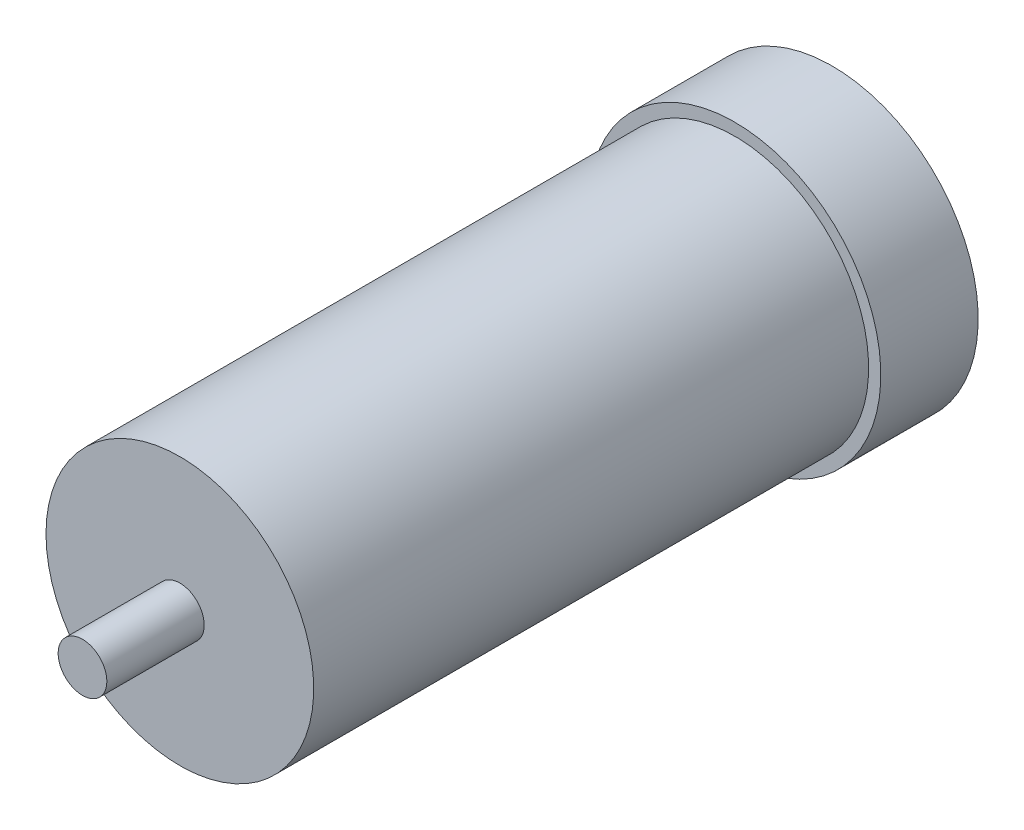
ISO-10303-21;
HEADER;
FILE_DESCRIPTION(('STEP AP214'),'2;1');
FILE_NAME('part.step','',(''),(''),'','','');
FILE_SCHEMA(('AUTOMOTIVE_DESIGN { 1 0 10303 214 1 1 1 1 }'));
ENDSEC;
DATA;
#1=APPLICATION_CONTEXT('core data for automotive mechanical design processes');
#2=APPLICATION_PROTOCOL_DEFINITION('international standard','automotive_design',2000,#1);
#3=PRODUCT_CONTEXT('',#1,'mechanical');
#4=PRODUCT('Part','Part','',(#3));
#5=PRODUCT_RELATED_PRODUCT_CATEGORY('part','',(#4));
#6=PRODUCT_DEFINITION_FORMATION('','',#4);
#7=PRODUCT_DEFINITION_CONTEXT('part definition',#1,'design');
#8=PRODUCT_DEFINITION('design','',#6,#7);
#9=PRODUCT_DEFINITION_SHAPE('','',#8);
#10=(LENGTH_UNIT() NAMED_UNIT(*) SI_UNIT(.MILLI.,.METRE.));
#11=(NAMED_UNIT(*) PLANE_ANGLE_UNIT() SI_UNIT($,.RADIAN.));
#12=(NAMED_UNIT(*) SI_UNIT($,.STERADIAN.) SOLID_ANGLE_UNIT());
#13=UNCERTAINTY_MEASURE_WITH_UNIT(LENGTH_MEASURE(1.E-05),#10,'distance_accuracy_value','');
#14=(GEOMETRIC_REPRESENTATION_CONTEXT(3) GLOBAL_UNCERTAINTY_ASSIGNED_CONTEXT((#13)) GLOBAL_UNIT_ASSIGNED_CONTEXT((#10,
#11,#12)) REPRESENTATION_CONTEXT('',''));
#15=CARTESIAN_POINT('',(0.,0.,0.));
#16=DIRECTION('',(0.,0.,1.));
#17=DIRECTION('',(1.,0.,0.));
#18=AXIS2_PLACEMENT_3D('',#15,#16,#17);
#19=CARTESIAN_POINT('',(0.,0.,114.));
#20=DIRECTION('',(0.,0.,-1.));
#21=DIRECTION('',(-1.,0.,0.));
#22=AXIS2_PLACEMENT_3D('',#19,#20,#21);
#23=CYLINDRICAL_SURFACE('',#22,27.5);
#24=CARTESIAN_POINT('',(0.,0.,114.));
#25=DIRECTION('',(0.,0.,1.));
#26=DIRECTION('',(1.,0.,0.));
#27=AXIS2_PLACEMENT_3D('',#24,#25,#26);
#28=CIRCLE('',#27,27.5);
#29=CARTESIAN_POINT('',(-27.5,0.,114.));
#30=VERTEX_POINT('',#29);
#31=EDGE_CURVE('E38',#30,#30,#28,.T.);
#32=CARTESIAN_POINT('',(0.,0.,0.));
#33=DIRECTION('',(0.,0.,1.));
#34=DIRECTION('',(1.,0.,0.));
#35=AXIS2_PLACEMENT_3D('',#32,#33,#34);
#36=CIRCLE('',#35,27.5);
#37=CARTESIAN_POINT('',(-27.5,0.,0.));
#38=VERTEX_POINT('',#37);
#39=EDGE_CURVE('E34',#38,#38,#36,.T.);
#40=CARTESIAN_POINT('',(-27.5,0.,114.));
#41=CARTESIAN_POINT('',(-27.5,0.,112.8125));
#42=CARTESIAN_POINT('',(-27.5,0.,111.625));
#43=CARTESIAN_POINT('',(-27.5,0.,109.25));
#44=CARTESIAN_POINT('',(-27.5,0.,108.0625));
#45=CARTESIAN_POINT('',(-27.5,0.,105.6875));
#46=CARTESIAN_POINT('',(-27.5,0.,104.5));
#47=CARTESIAN_POINT('',(-27.5,0.,102.125));
#48=CARTESIAN_POINT('',(-27.5,0.,100.9375));
#49=CARTESIAN_POINT('',(-27.5,0.,98.5625));
#50=CARTESIAN_POINT('',(-27.5,0.,97.375));
#51=CARTESIAN_POINT('',(-27.5,0.,95.));
#52=CARTESIAN_POINT('',(-27.5,0.,93.8125));
#53=CARTESIAN_POINT('',(-27.5,0.,91.4375));
#54=CARTESIAN_POINT('',(-27.5,0.,90.25));
#55=CARTESIAN_POINT('',(-27.5,0.,87.875));
#56=CARTESIAN_POINT('',(-27.5,0.,86.6875));
#57=CARTESIAN_POINT('',(-27.5,0.,84.3125));
#58=CARTESIAN_POINT('',(-27.5,0.,83.125));
#59=CARTESIAN_POINT('',(-27.5,0.,80.75));
#60=CARTESIAN_POINT('',(-27.5,0.,79.5625));
#61=CARTESIAN_POINT('',(-27.5,0.,77.1875));
#62=CARTESIAN_POINT('',(-27.5,0.,76.));
#63=CARTESIAN_POINT('',(-27.5,0.,73.625));
#64=CARTESIAN_POINT('',(-27.5,0.,72.4375));
#65=CARTESIAN_POINT('',(-27.5,0.,70.0625));
#66=CARTESIAN_POINT('',(-27.5,0.,68.875));
#67=CARTESIAN_POINT('',(-27.5,0.,66.5));
#68=CARTESIAN_POINT('',(-27.5,0.,65.3125));
#69=CARTESIAN_POINT('',(-27.5,0.,62.9375));
#70=CARTESIAN_POINT('',(-27.5,0.,61.75));
#71=CARTESIAN_POINT('',(-27.5,0.,59.375));
#72=CARTESIAN_POINT('',(-27.5,0.,58.1875));
#73=CARTESIAN_POINT('',(-27.5,0.,55.8125));
#74=CARTESIAN_POINT('',(-27.5,0.,54.625));
#75=CARTESIAN_POINT('',(-27.5,0.,52.25));
#76=CARTESIAN_POINT('',(-27.5,0.,51.0625));
#77=CARTESIAN_POINT('',(-27.5,0.,48.6875));
#78=CARTESIAN_POINT('',(-27.5,0.,47.5));
#79=CARTESIAN_POINT('',(-27.5,0.,45.125));
#80=CARTESIAN_POINT('',(-27.5,0.,43.9375));
#81=CARTESIAN_POINT('',(-27.5,0.,41.5625));
#82=CARTESIAN_POINT('',(-27.5,0.,40.375));
#83=CARTESIAN_POINT('',(-27.5,0.,38.));
#84=CARTESIAN_POINT('',(-27.5,0.,36.8125));
#85=CARTESIAN_POINT('',(-27.5,0.,34.4375));
#86=CARTESIAN_POINT('',(-27.5,0.,33.25));
#87=CARTESIAN_POINT('',(-27.5,0.,30.875));
#88=CARTESIAN_POINT('',(-27.5,0.,29.6875));
#89=CARTESIAN_POINT('',(-27.5,0.,27.3125));
#90=CARTESIAN_POINT('',(-27.5,0.,26.125));
#91=CARTESIAN_POINT('',(-27.5,0.,23.75));
#92=CARTESIAN_POINT('',(-27.5,0.,22.5625));
#93=CARTESIAN_POINT('',(-27.5,0.,20.1875));
#94=CARTESIAN_POINT('',(-27.5,0.,19.));
#95=CARTESIAN_POINT('',(-27.5,0.,16.625));
#96=CARTESIAN_POINT('',(-27.5,0.,15.4375));
#97=CARTESIAN_POINT('',(-27.5,0.,13.0625));
#98=CARTESIAN_POINT('',(-27.5,0.,11.875));
#99=CARTESIAN_POINT('',(-27.5,0.,9.5));
#100=CARTESIAN_POINT('',(-27.5,0.,8.31250000000001));
#101=CARTESIAN_POINT('',(-27.5,0.,5.9375));
#102=CARTESIAN_POINT('',(-27.5,0.,4.75));
#103=CARTESIAN_POINT('',(-27.5,0.,2.375));
#104=CARTESIAN_POINT('',(-27.5,0.,1.1875));
#105=CARTESIAN_POINT('',(-27.5,0.,0.));
#106=B_SPLINE_CURVE_WITH_KNOTS('',3,(#40,#41,#42,#43,#44,#45,#46,#47,#48,#49,#50,#51,#52,#53,
#54,#55,#56,#57,#58,#59,#60,#61,#62,#63,#64,#65,#66,#67,#68,#69,#70,#71,#72,#73,#74,#75,#76,#77,
#78,#79,#80,#81,#82,#83,#84,#85,#86,#87,#88,#89,#90,#91,#92,#93,#94,#95,#96,#97,#98,#99,#100,
#101,#102,#103,#104,#105),.UNSPECIFIED.,.F.,.F.,(4,2,2,2,2,2,2,2,2,2,2,2,2,2,2,2,2,2,2,2,2,2,2,
2,2,2,2,2,2,2,2,2,4),(0.,3.56250000000001,7.12500000000001,10.6875,14.25,17.8125,21.375,24.9375,
28.5,32.0625,35.625,39.1875,42.75,46.3125,49.875,53.4375,57.,60.5625,64.125,67.6875,71.25,
74.8125,78.375,81.9375,85.5,89.0625,92.625,96.1875,99.75,103.3125,106.875,110.4375,114.),.UNSPECIFIED.);
#107=EDGE_CURVE('BSEAM31',#30,#38,#106,.T.);
#108=ORIENTED_EDGE('',*,*,#31,.F.);
#109=ORIENTED_EDGE('',*,*,#39,.T.);
#110=ORIENTED_EDGE('',*,*,#107,.T.);
#111=ORIENTED_EDGE('',*,*,#107,.F.);
#112=EDGE_LOOP('',(#108,#110,#109,#111));
#113=FACE_BOUND('',#112,.T.);
#114=ADVANCED_FACE('F31',(#113),#23,.T.);
#115=CARTESIAN_POINT('',(0.,0.,114.));
#116=DIRECTION('',(0.,0.,1.));
#117=DIRECTION('',(1.,0.,0.));
#118=AXIS2_PLACEMENT_3D('',#115,#116,#117);
#119=PLANE('',#118);
#120=CARTESIAN_POINT('',(0.,0.,114.));
#121=DIRECTION('',(0.,0.,1.));
#122=DIRECTION('',(1.,0.,0.));
#123=AXIS2_PLACEMENT_3D('',#120,#121,#122);
#124=CIRCLE('',#123,5.);
#125=CARTESIAN_POINT('',(5.,0.,114.));
#126=VERTEX_POINT('',#125);
#127=EDGE_CURVE('E10',#126,#126,#124,.T.);
#128=ORIENTED_EDGE('',*,*,#127,.F.);
#129=EDGE_LOOP('',(#128));
#130=FACE_BOUND('',#129,.T.);
#131=ORIENTED_EDGE('',*,*,#31,.T.);
#132=EDGE_LOOP('',(#131));
#133=FACE_BOUND('',#132,.T.);
#134=ADVANCED_FACE('F72',(#130,#133),#119,.T.);
#135=CARTESIAN_POINT('',(0.,0.,-20.));
#136=DIRECTION('',(0.,0.,1.));
#137=DIRECTION('',(1.,0.,0.));
#138=AXIS2_PLACEMENT_3D('',#135,#136,#137);
#139=CYLINDRICAL_SURFACE('',#138,30.);
#140=CARTESIAN_POINT('',(0.,0.,-20.));
#141=DIRECTION('',(0.,0.,-1.));
#142=DIRECTION('',(-1.,0.,0.));
#143=AXIS2_PLACEMENT_3D('',#140,#141,#142);
#144=CIRCLE('',#143,30.);
#145=CARTESIAN_POINT('',(-30.,0.,-20.));
#146=VERTEX_POINT('',#145);
#147=EDGE_CURVE('E46',#146,#146,#144,.T.);
#148=ORIENTED_EDGE('',*,*,#147,.F.);
#149=EDGE_LOOP('',(#148));
#150=FACE_BOUND('',#149,.T.);
#151=CARTESIAN_POINT('',(0.,0.,0.));
#152=DIRECTION('',(0.,0.,-1.));
#153=DIRECTION('',(-1.,0.,0.));
#154=AXIS2_PLACEMENT_3D('',#151,#152,#153);
#155=CIRCLE('',#154,30.);
#156=CARTESIAN_POINT('',(-30.,0.,0.));
#157=VERTEX_POINT('',#156);
#158=EDGE_CURVE('E49',#157,#157,#155,.T.);
#159=ORIENTED_EDGE('',*,*,#158,.T.);
#160=EDGE_LOOP('',(#159));
#161=FACE_BOUND('',#160,.T.);
#162=ADVANCED_FACE('F77',(#150,#161),#139,.T.);
#163=CARTESIAN_POINT('',(0.,0.,-20.));
#164=DIRECTION('',(0.,0.,-1.));
#165=DIRECTION('',(-1.,0.,0.));
#166=AXIS2_PLACEMENT_3D('',#163,#164,#165);
#167=PLANE('',#166);
#168=ORIENTED_EDGE('',*,*,#147,.T.);
#169=EDGE_LOOP('',(#168));
#170=FACE_BOUND('',#169,.T.);
#171=ADVANCED_FACE('F67',(#170),#167,.T.);
#172=CARTESIAN_POINT('',(0.,0.,0.));
#173=DIRECTION('',(0.,0.,-1.));
#174=DIRECTION('',(-1.,0.,0.));
#175=AXIS2_PLACEMENT_3D('',#172,#173,#174);
#176=PLANE('',#175);
#177=ORIENTED_EDGE('',*,*,#39,.F.);
#178=EDGE_LOOP('',(#177));
#179=FACE_BOUND('',#178,.T.);
#180=ORIENTED_EDGE('',*,*,#158,.F.);
#181=EDGE_LOOP('',(#180));
#182=FACE_BOUND('',#181,.T.);
#183=ADVANCED_FACE('F60',(#179,#182),#176,.F.);
#184=CARTESIAN_POINT('',(0.,0.,134.));
#185=DIRECTION('',(0.,0.,-1.));
#186=DIRECTION('',(-1.,0.,0.));
#187=AXIS2_PLACEMENT_3D('',#184,#185,#186);
#188=CYLINDRICAL_SURFACE('',#187,5.);
#189=CARTESIAN_POINT('',(0.,0.,134.));
#190=DIRECTION('',(0.,0.,1.));
#191=DIRECTION('',(1.,0.,0.));
#192=AXIS2_PLACEMENT_3D('',#189,#190,#191);
#193=CIRCLE('',#192,5.);
#194=CARTESIAN_POINT('',(5.,0.,134.));
#195=VERTEX_POINT('',#194);
#196=EDGE_CURVE('E45',#195,#195,#193,.T.);
#197=ORIENTED_EDGE('',*,*,#196,.F.);
#198=EDGE_LOOP('',(#197));
#199=FACE_BOUND('',#198,.T.);
#200=ORIENTED_EDGE('',*,*,#127,.T.);
#201=EDGE_LOOP('',(#200));
#202=FACE_BOUND('',#201,.T.);
#203=ADVANCED_FACE('F58',(#199,#202),#188,.T.);
#204=CARTESIAN_POINT('',(0.,0.,134.));
#205=DIRECTION('',(0.,0.,1.));
#206=DIRECTION('',(1.,0.,0.));
#207=AXIS2_PLACEMENT_3D('',#204,#205,#206);
#208=PLANE('',#207);
#209=ORIENTED_EDGE('',*,*,#196,.T.);
#210=EDGE_LOOP('',(#209));
#211=FACE_BOUND('',#210,.T.);
#212=ADVANCED_FACE('F56',(#211),#208,.T.);
#213=CLOSED_SHELL('',(#114,#134,#162,#171,#183,#203,#212));
#214=MANIFOLD_SOLID_BREP('B2',#213);
#215=ADVANCED_BREP_SHAPE_REPRESENTATION('',(#18,#214),#14);
#216=SHAPE_DEFINITION_REPRESENTATION(#9,#215);
ENDSEC;
END-ISO-10303-21;
